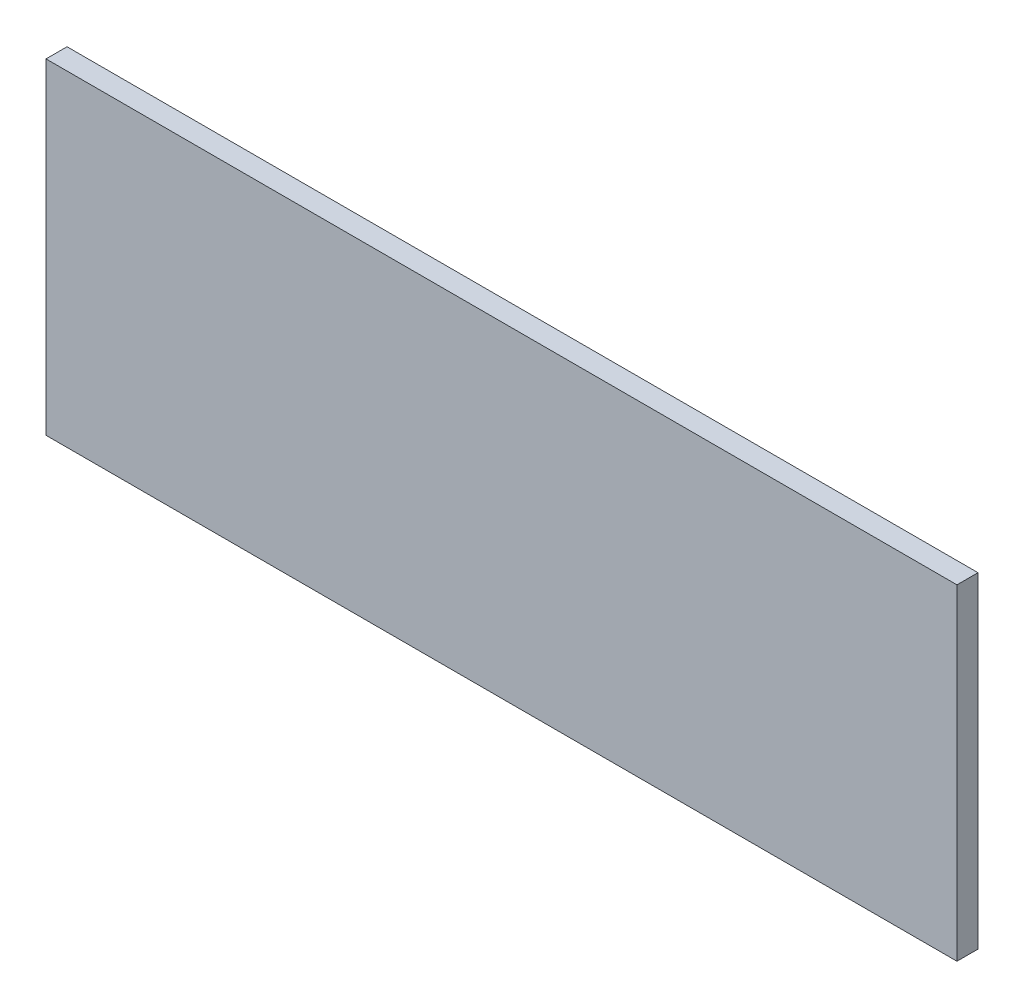
ISO-10303-21;
HEADER;
FILE_DESCRIPTION(('STEP AP214'),'2;1');
FILE_NAME('part.step','',(''),(''),'','','');
FILE_SCHEMA(('AUTOMOTIVE_DESIGN { 1 0 10303 214 1 1 1 1 }'));
ENDSEC;
DATA;
#1=APPLICATION_CONTEXT('core data for automotive mechanical design processes');
#2=APPLICATION_PROTOCOL_DEFINITION('international standard','automotive_design',2000,#1);
#3=PRODUCT_CONTEXT('',#1,'mechanical');
#4=PRODUCT('Part','Part','',(#3));
#5=PRODUCT_RELATED_PRODUCT_CATEGORY('part','',(#4));
#6=PRODUCT_DEFINITION_FORMATION('','',#4);
#7=PRODUCT_DEFINITION_CONTEXT('part definition',#1,'design');
#8=PRODUCT_DEFINITION('design','',#6,#7);
#9=PRODUCT_DEFINITION_SHAPE('','',#8);
#10=(LENGTH_UNIT() NAMED_UNIT(*) SI_UNIT(.MILLI.,.METRE.));
#11=(NAMED_UNIT(*) PLANE_ANGLE_UNIT() SI_UNIT($,.RADIAN.));
#12=(NAMED_UNIT(*) SI_UNIT($,.STERADIAN.) SOLID_ANGLE_UNIT());
#13=UNCERTAINTY_MEASURE_WITH_UNIT(LENGTH_MEASURE(1.E-05),#10,'distance_accuracy_value','');
#14=(GEOMETRIC_REPRESENTATION_CONTEXT(3) GLOBAL_UNCERTAINTY_ASSIGNED_CONTEXT((#13)) GLOBAL_UNIT_ASSIGNED_CONTEXT((#10,
#11,#12)) REPRESENTATION_CONTEXT('',''));
#15=CARTESIAN_POINT('',(0.,0.,0.));
#16=DIRECTION('',(0.,0.,1.));
#17=DIRECTION('',(1.,0.,0.));
#18=AXIS2_PLACEMENT_3D('',#15,#16,#17);
#19=CARTESIAN_POINT('',(-346.5,-124.,16.));
#20=DIRECTION('',(1.,0.,0.));
#21=DIRECTION('',(0.,0.,-1.));
#22=AXIS2_PLACEMENT_3D('',#19,#20,#21);
#23=PLANE('',#22);
#24=DIRECTION('',(0.,-1.,0.));
#25=VECTOR('',#24,1.);
#26=CARTESIAN_POINT('',(-346.5,-124.,0.));
#27=LINE('',#26,#25);
#28=CARTESIAN_POINT('',(-346.5,124.,0.));
#29=VERTEX_POINT('',#28);
#30=CARTESIAN_POINT('',(-346.5,-124.,0.));
#31=VERTEX_POINT('',#30);
#32=EDGE_CURVE('E98',#29,#31,#27,.T.);
#33=ORIENTED_EDGE('',*,*,#32,.T.);
#34=DIRECTION('',(0.,0.,-1.));
#35=VECTOR('',#34,1.);
#36=CARTESIAN_POINT('',(-346.5,-124.,16.));
#37=LINE('',#36,#35);
#38=CARTESIAN_POINT('',(-346.5,-124.,16.));
#39=VERTEX_POINT('',#38);
#40=EDGE_CURVE('E11',#39,#31,#37,.T.);
#41=ORIENTED_EDGE('',*,*,#40,.F.);
#42=DIRECTION('',(0.,-1.,0.));
#43=VECTOR('',#42,1.);
#44=CARTESIAN_POINT('',(-346.5,-124.,16.));
#45=LINE('',#44,#43);
#46=CARTESIAN_POINT('',(-346.5,124.,16.));
#47=VERTEX_POINT('',#46);
#48=EDGE_CURVE('E86',#47,#39,#45,.T.);
#49=ORIENTED_EDGE('',*,*,#48,.F.);
#50=DIRECTION('',(0.,0.,-1.));
#51=VECTOR('',#50,1.);
#52=CARTESIAN_POINT('',(-346.5,124.,16.));
#53=LINE('',#52,#51);
#54=EDGE_CURVE('E94',#47,#29,#53,.T.);
#55=ORIENTED_EDGE('',*,*,#54,.T.);
#56=EDGE_LOOP('',(#33,#41,#49,#55));
#57=FACE_BOUND('',#56,.T.);
#58=ADVANCED_FACE('F35',(#57),#23,.F.);
#59=CARTESIAN_POINT('',(346.5,-124.,16.));
#60=DIRECTION('',(0.,1.,0.));
#61=DIRECTION('',(-1.,0.,0.));
#62=AXIS2_PLACEMENT_3D('',#59,#60,#61);
#63=PLANE('',#62);
#64=DIRECTION('',(1.,0.,0.));
#65=VECTOR('',#64,1.);
#66=CARTESIAN_POINT('',(346.5,-124.,0.));
#67=LINE('',#66,#65);
#68=CARTESIAN_POINT('',(346.5,-124.,0.));
#69=VERTEX_POINT('',#68);
#70=EDGE_CURVE('E90',#31,#69,#67,.T.);
#71=ORIENTED_EDGE('',*,*,#70,.T.);
#72=DIRECTION('',(0.,0.,-1.));
#73=VECTOR('',#72,1.);
#74=CARTESIAN_POINT('',(346.5,-124.,16.));
#75=LINE('',#74,#73);
#76=CARTESIAN_POINT('',(346.5,-124.,16.));
#77=VERTEX_POINT('',#76);
#78=EDGE_CURVE('E43',#77,#69,#75,.T.);
#79=ORIENTED_EDGE('',*,*,#78,.F.);
#80=DIRECTION('',(1.,0.,0.));
#81=VECTOR('',#80,1.);
#82=CARTESIAN_POINT('',(346.5,-124.,16.));
#83=LINE('',#82,#81);
#84=EDGE_CURVE('E81',#39,#77,#83,.T.);
#85=ORIENTED_EDGE('',*,*,#84,.F.);
#86=ORIENTED_EDGE('',*,*,#40,.T.);
#87=EDGE_LOOP('',(#71,#79,#85,#86));
#88=FACE_BOUND('',#87,.T.);
#89=ADVANCED_FACE('F89',(#88),#63,.F.);
#90=CARTESIAN_POINT('',(346.5,-124.,16.));
#91=DIRECTION('',(-1.,0.,0.));
#92=DIRECTION('',(0.,0.,1.));
#93=AXIS2_PLACEMENT_3D('',#90,#91,#92);
#94=PLANE('',#93);
#95=DIRECTION('',(0.,1.,0.));
#96=VECTOR('',#95,1.);
#97=CARTESIAN_POINT('',(346.5,-124.,0.));
#98=LINE('',#97,#96);
#99=CARTESIAN_POINT('',(346.5,124.,0.));
#100=VERTEX_POINT('',#99);
#101=EDGE_CURVE('E68',#69,#100,#98,.T.);
#102=ORIENTED_EDGE('',*,*,#101,.T.);
#103=DIRECTION('',(0.,0.,-1.));
#104=VECTOR('',#103,1.);
#105=CARTESIAN_POINT('',(346.5,124.,16.));
#106=LINE('',#105,#104);
#107=CARTESIAN_POINT('',(346.5,124.,16.));
#108=VERTEX_POINT('',#107);
#109=EDGE_CURVE('E91',#108,#100,#106,.T.);
#110=ORIENTED_EDGE('',*,*,#109,.F.);
#111=DIRECTION('',(0.,1.,0.));
#112=VECTOR('',#111,1.);
#113=CARTESIAN_POINT('',(346.5,-124.,16.));
#114=LINE('',#113,#112);
#115=EDGE_CURVE('E84',#77,#108,#114,.T.);
#116=ORIENTED_EDGE('',*,*,#115,.F.);
#117=ORIENTED_EDGE('',*,*,#78,.T.);
#118=EDGE_LOOP('',(#102,#110,#116,#117));
#119=FACE_BOUND('',#118,.T.);
#120=ADVANCED_FACE('F92',(#119),#94,.F.);
#121=CARTESIAN_POINT('',(346.5,124.,16.));
#122=DIRECTION('',(0.,-1.,0.));
#123=DIRECTION('',(1.,0.,0.));
#124=AXIS2_PLACEMENT_3D('',#121,#122,#123);
#125=PLANE('',#124);
#126=DIRECTION('',(-1.,0.,0.));
#127=VECTOR('',#126,1.);
#128=CARTESIAN_POINT('',(346.5,124.,0.));
#129=LINE('',#128,#127);
#130=EDGE_CURVE('E74',#100,#29,#129,.T.);
#131=ORIENTED_EDGE('',*,*,#130,.T.);
#132=ORIENTED_EDGE('',*,*,#54,.F.);
#133=DIRECTION('',(-1.,0.,0.));
#134=VECTOR('',#133,1.);
#135=CARTESIAN_POINT('',(346.5,124.,16.));
#136=LINE('',#135,#134);
#137=EDGE_CURVE('E51',#108,#47,#136,.T.);
#138=ORIENTED_EDGE('',*,*,#137,.F.);
#139=ORIENTED_EDGE('',*,*,#109,.T.);
#140=EDGE_LOOP('',(#131,#132,#138,#139));
#141=FACE_BOUND('',#140,.T.);
#142=ADVANCED_FACE('F105',(#141),#125,.F.);
#143=CARTESIAN_POINT('',(0.,0.,16.));
#144=DIRECTION('',(0.,0.,1.));
#145=DIRECTION('',(1.,0.,0.));
#146=AXIS2_PLACEMENT_3D('',#143,#144,#145);
#147=PLANE('',#146);
#148=ORIENTED_EDGE('',*,*,#48,.T.);
#149=ORIENTED_EDGE('',*,*,#84,.T.);
#150=ORIENTED_EDGE('',*,*,#115,.T.);
#151=ORIENTED_EDGE('',*,*,#137,.T.);
#152=EDGE_LOOP('',(#148,#149,#150,#151));
#153=FACE_BOUND('',#152,.T.);
#154=ADVANCED_FACE('F82',(#153),#147,.T.);
#155=CARTESIAN_POINT('',(0.,0.,0.));
#156=DIRECTION('',(0.,0.,1.));
#157=DIRECTION('',(1.,0.,0.));
#158=AXIS2_PLACEMENT_3D('',#155,#156,#157);
#159=PLANE('',#158);
#160=ORIENTED_EDGE('',*,*,#32,.F.);
#161=ORIENTED_EDGE('',*,*,#130,.F.);
#162=ORIENTED_EDGE('',*,*,#101,.F.);
#163=ORIENTED_EDGE('',*,*,#70,.F.);
#164=EDGE_LOOP('',(#160,#161,#162,#163));
#165=FACE_BOUND('',#164,.T.);
#166=ADVANCED_FACE('F108',(#165),#159,.F.);
#167=CLOSED_SHELL('',(#58,#89,#120,#142,#154,#166));
#168=MANIFOLD_SOLID_BREP('B2',#167);
#169=ADVANCED_BREP_SHAPE_REPRESENTATION('',(#18,#168),#14);
#170=SHAPE_DEFINITION_REPRESENTATION(#9,#169);
ENDSEC;
END-ISO-10303-21;
